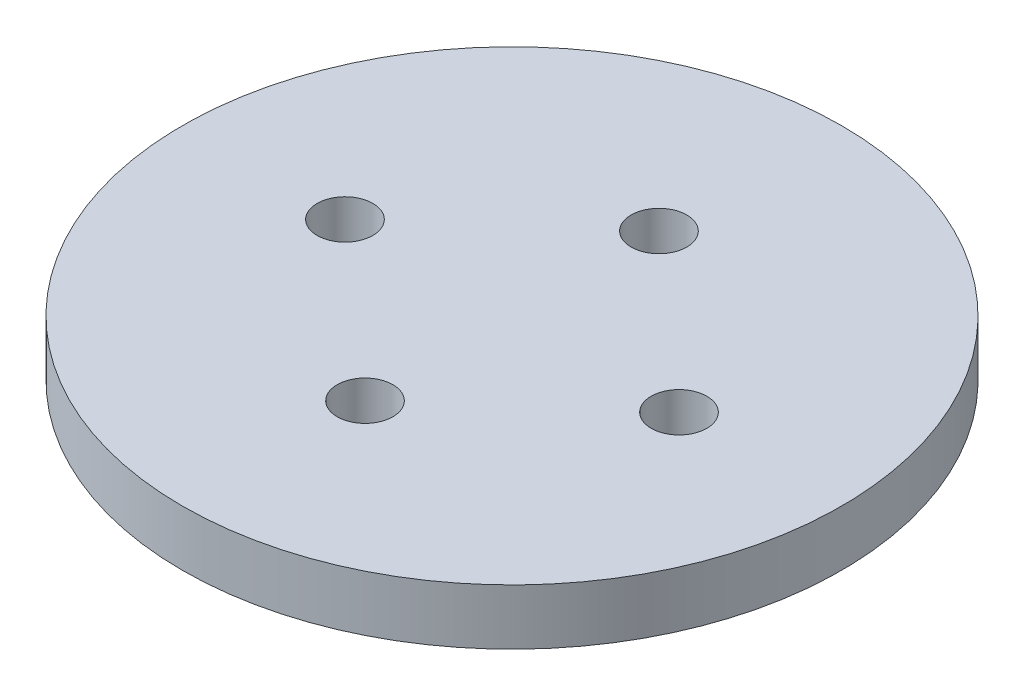
ISO-10303-21;
HEADER;
FILE_DESCRIPTION(('STEP AP214'),'2;1');
FILE_NAME('part.step','',(''),(''),'','','');
FILE_SCHEMA(('AUTOMOTIVE_DESIGN { 1 0 10303 214 1 1 1 1 }'));
ENDSEC;
DATA;
#1=APPLICATION_CONTEXT('core data for automotive mechanical design processes');
#2=APPLICATION_PROTOCOL_DEFINITION('international standard','automotive_design',2000,#1);
#3=PRODUCT_CONTEXT('',#1,'mechanical');
#4=PRODUCT('Part','Part','',(#3));
#5=PRODUCT_RELATED_PRODUCT_CATEGORY('part','',(#4));
#6=PRODUCT_DEFINITION_FORMATION('','',#4);
#7=PRODUCT_DEFINITION_CONTEXT('part definition',#1,'design');
#8=PRODUCT_DEFINITION('design','',#6,#7);
#9=PRODUCT_DEFINITION_SHAPE('','',#8);
#10=(LENGTH_UNIT() NAMED_UNIT(*) SI_UNIT(.MILLI.,.METRE.));
#11=(NAMED_UNIT(*) PLANE_ANGLE_UNIT() SI_UNIT($,.RADIAN.));
#12=(NAMED_UNIT(*) SI_UNIT($,.STERADIAN.) SOLID_ANGLE_UNIT());
#13=UNCERTAINTY_MEASURE_WITH_UNIT(LENGTH_MEASURE(1.E-05),#10,'distance_accuracy_value','');
#14=(GEOMETRIC_REPRESENTATION_CONTEXT(3) GLOBAL_UNCERTAINTY_ASSIGNED_CONTEXT((#13)) GLOBAL_UNIT_ASSIGNED_CONTEXT((#10,
#11,#12)) REPRESENTATION_CONTEXT('',''));
#15=CARTESIAN_POINT('',(0.,0.,0.));
#16=DIRECTION('',(0.,0.,1.));
#17=DIRECTION('',(1.,0.,0.));
#18=AXIS2_PLACEMENT_3D('',#15,#16,#17);
#19=CARTESIAN_POINT('',(0.,6.35,0.));
#20=DIRECTION('',(0.,1.,0.));
#21=DIRECTION('',(0.,0.,1.));
#22=AXIS2_PLACEMENT_3D('',#19,#20,#21);
#23=PLANE('',#22);
#24=CARTESIAN_POINT('',(-19.05,6.35,0.));
#25=DIRECTION('',(0.,1.,0.));
#26=DIRECTION('',(0.,0.,1.));
#27=AXIS2_PLACEMENT_3D('',#24,#25,#26);
#28=CIRCLE('',#27,3.175);
#29=CARTESIAN_POINT('',(-19.05,6.35,3.175));
#30=VERTEX_POINT('',#29);
#31=EDGE_CURVE('E60',#30,#30,#28,.T.);
#32=ORIENTED_EDGE('',*,*,#31,.F.);
#33=EDGE_LOOP('',(#32));
#34=FACE_BOUND('',#33,.T.);
#35=CARTESIAN_POINT('',(0.,6.35,-16.764));
#36=DIRECTION('',(0.,1.,0.));
#37=DIRECTION('',(0.,0.,1.));
#38=AXIS2_PLACEMENT_3D('',#35,#36,#37);
#39=CIRCLE('',#38,3.175);
#40=CARTESIAN_POINT('',(0.,6.35,-13.589));
#41=VERTEX_POINT('',#40);
#42=EDGE_CURVE('E49',#41,#41,#39,.T.);
#43=ORIENTED_EDGE('',*,*,#42,.F.);
#44=EDGE_LOOP('',(#43));
#45=FACE_BOUND('',#44,.T.);
#46=CARTESIAN_POINT('',(0.,6.35,0.));
#47=DIRECTION('',(0.,1.,0.));
#48=DIRECTION('',(0.,0.,1.));
#49=AXIS2_PLACEMENT_3D('',#46,#47,#48);
#50=CIRCLE('',#49,37.592);
#51=CARTESIAN_POINT('',(0.,6.35,37.592));
#52=VERTEX_POINT('',#51);
#53=EDGE_CURVE('E10',#52,#52,#50,.T.);
#54=ORIENTED_EDGE('',*,*,#53,.T.);
#55=EDGE_LOOP('',(#54));
#56=FACE_BOUND('',#55,.T.);
#57=CARTESIAN_POINT('',(0.,6.35,16.764));
#58=DIRECTION('',(0.,1.,0.));
#59=DIRECTION('',(0.,0.,1.));
#60=AXIS2_PLACEMENT_3D('',#57,#58,#59);
#61=CIRCLE('',#60,3.175);
#62=CARTESIAN_POINT('',(0.,6.35,19.939));
#63=VERTEX_POINT('',#62);
#64=EDGE_CURVE('E54',#63,#63,#61,.T.);
#65=ORIENTED_EDGE('',*,*,#64,.F.);
#66=EDGE_LOOP('',(#65));
#67=FACE_BOUND('',#66,.T.);
#68=CARTESIAN_POINT('',(19.05,6.35,0.));
#69=DIRECTION('',(0.,1.,0.));
#70=DIRECTION('',(0.,0.,1.));
#71=AXIS2_PLACEMENT_3D('',#68,#69,#70);
#72=CIRCLE('',#71,3.17500000000001);
#73=CARTESIAN_POINT('',(19.05,6.35,3.17500000000001));
#74=VERTEX_POINT('',#73);
#75=EDGE_CURVE('E66',#74,#74,#72,.T.);
#76=ORIENTED_EDGE('',*,*,#75,.F.);
#77=EDGE_LOOP('',(#76));
#78=FACE_BOUND('',#77,.T.);
#79=ADVANCED_FACE('F38',(#34,#45,#56,#67,#78),#23,.T.);
#80=CARTESIAN_POINT('',(0.,0.,0.));
#81=DIRECTION('',(0.,1.,0.));
#82=DIRECTION('',(0.,0.,1.));
#83=AXIS2_PLACEMENT_3D('',#80,#81,#82);
#84=PLANE('',#83);
#85=CARTESIAN_POINT('',(0.,0.,0.));
#86=DIRECTION('',(0.,1.,0.));
#87=DIRECTION('',(0.,0.,1.));
#88=AXIS2_PLACEMENT_3D('',#85,#86,#87);
#89=CIRCLE('',#88,37.592);
#90=CARTESIAN_POINT('',(0.,0.,37.592));
#91=VERTEX_POINT('',#90);
#92=EDGE_CURVE('E42',#91,#91,#89,.T.);
#93=ORIENTED_EDGE('',*,*,#92,.F.);
#94=EDGE_LOOP('',(#93));
#95=FACE_BOUND('',#94,.T.);
#96=CARTESIAN_POINT('',(0.,0.,-16.764));
#97=DIRECTION('',(0.,1.,0.));
#98=DIRECTION('',(0.,0.,1.));
#99=AXIS2_PLACEMENT_3D('',#96,#97,#98);
#100=CIRCLE('',#99,3.175);
#101=CARTESIAN_POINT('',(0.,0.,-13.589));
#102=VERTEX_POINT('',#101);
#103=EDGE_CURVE('E51',#102,#102,#100,.T.);
#104=ORIENTED_EDGE('',*,*,#103,.T.);
#105=EDGE_LOOP('',(#104));
#106=FACE_BOUND('',#105,.T.);
#107=CARTESIAN_POINT('',(0.,0.,16.764));
#108=DIRECTION('',(0.,1.,0.));
#109=DIRECTION('',(0.,0.,1.));
#110=AXIS2_PLACEMENT_3D('',#107,#108,#109);
#111=CIRCLE('',#110,3.175);
#112=CARTESIAN_POINT('',(0.,0.,19.939));
#113=VERTEX_POINT('',#112);
#114=EDGE_CURVE('E57',#113,#113,#111,.T.);
#115=ORIENTED_EDGE('',*,*,#114,.T.);
#116=EDGE_LOOP('',(#115));
#117=FACE_BOUND('',#116,.T.);
#118=CARTESIAN_POINT('',(-19.05,0.,0.));
#119=DIRECTION('',(0.,1.,0.));
#120=DIRECTION('',(0.,0.,1.));
#121=AXIS2_PLACEMENT_3D('',#118,#119,#120);
#122=CIRCLE('',#121,3.175);
#123=CARTESIAN_POINT('',(-19.05,0.,3.175));
#124=VERTEX_POINT('',#123);
#125=EDGE_CURVE('E63',#124,#124,#122,.T.);
#126=ORIENTED_EDGE('',*,*,#125,.T.);
#127=EDGE_LOOP('',(#126));
#128=FACE_BOUND('',#127,.T.);
#129=CARTESIAN_POINT('',(19.05,0.,0.));
#130=DIRECTION('',(0.,1.,0.));
#131=DIRECTION('',(0.,0.,1.));
#132=AXIS2_PLACEMENT_3D('',#129,#130,#131);
#133=CIRCLE('',#132,3.17500000000001);
#134=CARTESIAN_POINT('',(19.05,0.,3.17500000000001));
#135=VERTEX_POINT('',#134);
#136=EDGE_CURVE('E69',#135,#135,#133,.T.);
#137=ORIENTED_EDGE('',*,*,#136,.T.);
#138=EDGE_LOOP('',(#137));
#139=FACE_BOUND('',#138,.T.);
#140=ADVANCED_FACE('F79',(#95,#106,#117,#128,#139),#84,.F.);
#141=CARTESIAN_POINT('',(0.,6.35,0.));
#142=DIRECTION('',(0.,-1.,0.));
#143=DIRECTION('',(0.,0.,-1.));
#144=AXIS2_PLACEMENT_3D('',#141,#142,#143);
#145=CYLINDRICAL_SURFACE('',#144,37.592);
#146=ORIENTED_EDGE('',*,*,#53,.F.);
#147=EDGE_LOOP('',(#146));
#148=FACE_BOUND('',#147,.T.);
#149=ORIENTED_EDGE('',*,*,#92,.T.);
#150=EDGE_LOOP('',(#149));
#151=FACE_BOUND('',#150,.T.);
#152=ADVANCED_FACE('F40',(#148,#151),#145,.T.);
#153=CARTESIAN_POINT('',(0.,6.35,-16.764));
#154=DIRECTION('',(0.,-1.,0.));
#155=DIRECTION('',(0.,0.,-1.));
#156=AXIS2_PLACEMENT_3D('',#153,#154,#155);
#157=CYLINDRICAL_SURFACE('',#156,3.175);
#158=ORIENTED_EDGE('',*,*,#42,.T.);
#159=EDGE_LOOP('',(#158));
#160=FACE_BOUND('',#159,.T.);
#161=ORIENTED_EDGE('',*,*,#103,.F.);
#162=EDGE_LOOP('',(#161));
#163=FACE_BOUND('',#162,.T.);
#164=ADVANCED_FACE('F89',(#160,#163),#157,.F.);
#165=CARTESIAN_POINT('',(0.,6.35,16.764));
#166=DIRECTION('',(0.,-1.,0.));
#167=DIRECTION('',(0.,0.,-1.));
#168=AXIS2_PLACEMENT_3D('',#165,#166,#167);
#169=CYLINDRICAL_SURFACE('',#168,3.175);
#170=ORIENTED_EDGE('',*,*,#64,.T.);
#171=EDGE_LOOP('',(#170));
#172=FACE_BOUND('',#171,.T.);
#173=ORIENTED_EDGE('',*,*,#114,.F.);
#174=EDGE_LOOP('',(#173));
#175=FACE_BOUND('',#174,.T.);
#176=ADVANCED_FACE('F92',(#172,#175),#169,.F.);
#177=CARTESIAN_POINT('',(-19.05,6.35,0.));
#178=DIRECTION('',(0.,-1.,0.));
#179=DIRECTION('',(0.,0.,-1.));
#180=AXIS2_PLACEMENT_3D('',#177,#178,#179);
#181=CYLINDRICAL_SURFACE('',#180,3.175);
#182=ORIENTED_EDGE('',*,*,#31,.T.);
#183=EDGE_LOOP('',(#182));
#184=FACE_BOUND('',#183,.T.);
#185=ORIENTED_EDGE('',*,*,#125,.F.);
#186=EDGE_LOOP('',(#185));
#187=FACE_BOUND('',#186,.T.);
#188=ADVANCED_FACE('F96',(#184,#187),#181,.F.);
#189=CARTESIAN_POINT('',(19.05,6.35,0.));
#190=DIRECTION('',(0.,-1.,0.));
#191=DIRECTION('',(0.,0.,-1.));
#192=AXIS2_PLACEMENT_3D('',#189,#190,#191);
#193=CYLINDRICAL_SURFACE('',#192,3.17500000000001);
#194=ORIENTED_EDGE('',*,*,#75,.T.);
#195=EDGE_LOOP('',(#194));
#196=FACE_BOUND('',#195,.T.);
#197=ORIENTED_EDGE('',*,*,#136,.F.);
#198=EDGE_LOOP('',(#197));
#199=FACE_BOUND('',#198,.T.);
#200=ADVANCED_FACE('F75',(#196,#199),#193,.F.);
#201=CLOSED_SHELL('',(#79,#140,#152,#164,#176,#188,#200));
#202=MANIFOLD_SOLID_BREP('B2',#201);
#203=ADVANCED_BREP_SHAPE_REPRESENTATION('',(#18,#202),#14);
#204=SHAPE_DEFINITION_REPRESENTATION(#9,#203);
ENDSEC;
END-ISO-10303-21;
